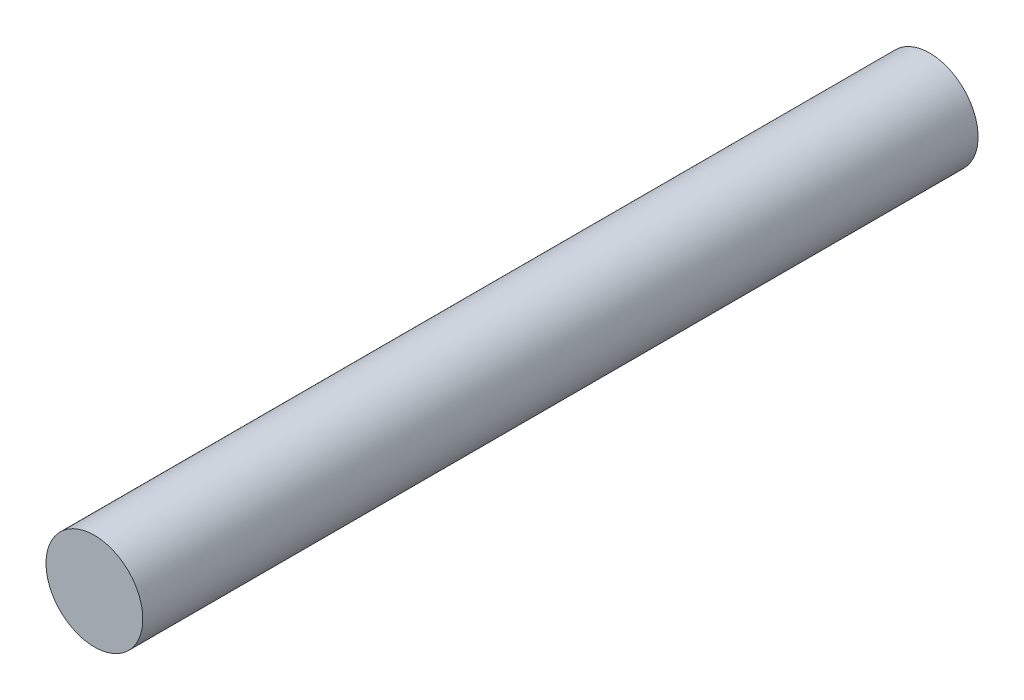
ISO-10303-21;
HEADER;
FILE_DESCRIPTION(('STEP AP214'),'2;1');
FILE_NAME('part.step','',(''),(''),'','','');
FILE_SCHEMA(('AUTOMOTIVE_DESIGN { 1 0 10303 214 1 1 1 1 }'));
ENDSEC;
DATA;
#1=APPLICATION_CONTEXT('core data for automotive mechanical design processes');
#2=APPLICATION_PROTOCOL_DEFINITION('international standard','automotive_design',2000,#1);
#3=PRODUCT_CONTEXT('',#1,'mechanical');
#4=PRODUCT('Part','Part','',(#3));
#5=PRODUCT_RELATED_PRODUCT_CATEGORY('part','',(#4));
#6=PRODUCT_DEFINITION_FORMATION('','',#4);
#7=PRODUCT_DEFINITION_CONTEXT('part definition',#1,'design');
#8=PRODUCT_DEFINITION('design','',#6,#7);
#9=PRODUCT_DEFINITION_SHAPE('','',#8);
#10=(LENGTH_UNIT() NAMED_UNIT(*) SI_UNIT(.MILLI.,.METRE.));
#11=(NAMED_UNIT(*) PLANE_ANGLE_UNIT() SI_UNIT($,.RADIAN.));
#12=(NAMED_UNIT(*) SI_UNIT($,.STERADIAN.) SOLID_ANGLE_UNIT());
#13=UNCERTAINTY_MEASURE_WITH_UNIT(LENGTH_MEASURE(1.E-05),#10,'distance_accuracy_value','');
#14=(GEOMETRIC_REPRESENTATION_CONTEXT(3) GLOBAL_UNCERTAINTY_ASSIGNED_CONTEXT((#13)) GLOBAL_UNIT_ASSIGNED_CONTEXT((#10,
#11,#12)) REPRESENTATION_CONTEXT('',''));
#15=CARTESIAN_POINT('',(0.,0.,0.));
#16=DIRECTION('',(0.,0.,1.));
#17=DIRECTION('',(1.,0.,0.));
#18=AXIS2_PLACEMENT_3D('',#15,#16,#17);
#19=CARTESIAN_POINT('',(0.,-2.49999999999999,96.8137084989847));
#20=DIRECTION('',(0.,0.,-1.));
#21=DIRECTION('',(-1.,0.,0.));
#22=AXIS2_PLACEMENT_3D('',#19,#20,#21);
#23=CYLINDRICAL_SURFACE('',#22,4.);
#24=CARTESIAN_POINT('',(0.,-2.49999999999999,76.5));
#25=DIRECTION('',(0.,0.,-1.));
#26=DIRECTION('',(-1.,0.,0.));
#27=AXIS2_PLACEMENT_3D('',#24,#25,#26);
#28=CIRCLE('',#27,4.);
#29=CARTESIAN_POINT('',(-4.,-2.49999999999999,76.5));
#30=VERTEX_POINT('',#29);
#31=EDGE_CURVE('E10',#30,#30,#28,.F.);
#32=CARTESIAN_POINT('',(0.,-2.49999999999999,7.5));
#33=DIRECTION('',(0.,0.,1.));
#34=DIRECTION('',(0.,-1.,0.));
#35=AXIS2_PLACEMENT_3D('',#32,#33,#34);
#36=CIRCLE('',#35,4.);
#37=CARTESIAN_POINT('',(-4.,-2.49999999999999,7.50000000000001));
#38=VERTEX_POINT('',#37);
#39=EDGE_CURVE('E39',#38,#38,#36,.T.);
#40=CARTESIAN_POINT('',(-4.,-2.49999999999999,76.5));
#41=CARTESIAN_POINT('',(-4.,-2.49999999999999,75.78125));
#42=CARTESIAN_POINT('',(-4.,-2.49999999999999,75.0625));
#43=CARTESIAN_POINT('',(-4.,-2.49999999999999,73.625));
#44=CARTESIAN_POINT('',(-4.,-2.49999999999999,72.90625));
#45=CARTESIAN_POINT('',(-4.,-2.49999999999999,71.46875));
#46=CARTESIAN_POINT('',(-4.,-2.49999999999999,70.75));
#47=CARTESIAN_POINT('',(-4.,-2.49999999999999,69.3125));
#48=CARTESIAN_POINT('',(-4.,-2.49999999999999,68.59375));
#49=CARTESIAN_POINT('',(-4.,-2.49999999999999,67.15625));
#50=CARTESIAN_POINT('',(-4.,-2.49999999999999,66.4375));
#51=CARTESIAN_POINT('',(-4.,-2.49999999999999,65.));
#52=CARTESIAN_POINT('',(-4.,-2.49999999999999,64.28125));
#53=CARTESIAN_POINT('',(-4.,-2.49999999999999,62.84375));
#54=CARTESIAN_POINT('',(-4.,-2.49999999999999,62.125));
#55=CARTESIAN_POINT('',(-4.,-2.49999999999999,60.6875));
#56=CARTESIAN_POINT('',(-4.,-2.49999999999999,59.96875));
#57=CARTESIAN_POINT('',(-4.,-2.49999999999999,58.53125));
#58=CARTESIAN_POINT('',(-4.,-2.49999999999999,57.8125));
#59=CARTESIAN_POINT('',(-4.,-2.49999999999999,56.375));
#60=CARTESIAN_POINT('',(-4.,-2.49999999999999,55.65625));
#61=CARTESIAN_POINT('',(-4.,-2.49999999999999,54.21875));
#62=CARTESIAN_POINT('',(-4.,-2.49999999999999,53.5));
#63=CARTESIAN_POINT('',(-4.,-2.49999999999999,52.0625));
#64=CARTESIAN_POINT('',(-4.,-2.49999999999999,51.34375));
#65=CARTESIAN_POINT('',(-4.,-2.49999999999999,49.90625));
#66=CARTESIAN_POINT('',(-4.,-2.49999999999999,49.1875));
#67=CARTESIAN_POINT('',(-4.,-2.49999999999999,47.75));
#68=CARTESIAN_POINT('',(-4.,-2.49999999999999,47.03125));
#69=CARTESIAN_POINT('',(-4.,-2.49999999999999,45.59375));
#70=CARTESIAN_POINT('',(-4.,-2.49999999999999,44.875));
#71=CARTESIAN_POINT('',(-4.,-2.49999999999999,43.4375));
#72=CARTESIAN_POINT('',(-4.,-2.49999999999999,42.71875));
#73=CARTESIAN_POINT('',(-4.,-2.49999999999999,41.28125));
#74=CARTESIAN_POINT('',(-4.,-2.49999999999999,40.5625));
#75=CARTESIAN_POINT('',(-4.,-2.49999999999999,39.125));
#76=CARTESIAN_POINT('',(-4.,-2.49999999999999,38.40625));
#77=CARTESIAN_POINT('',(-4.,-2.49999999999999,36.96875));
#78=CARTESIAN_POINT('',(-4.,-2.49999999999999,36.25));
#79=CARTESIAN_POINT('',(-4.,-2.49999999999999,34.8125));
#80=CARTESIAN_POINT('',(-4.,-2.49999999999999,34.09375));
#81=CARTESIAN_POINT('',(-4.,-2.49999999999999,32.65625));
#82=CARTESIAN_POINT('',(-4.,-2.49999999999999,31.9375));
#83=CARTESIAN_POINT('',(-4.,-2.49999999999999,30.5));
#84=CARTESIAN_POINT('',(-4.,-2.49999999999999,29.78125));
#85=CARTESIAN_POINT('',(-4.,-2.49999999999999,28.34375));
#86=CARTESIAN_POINT('',(-4.,-2.49999999999999,27.625));
#87=CARTESIAN_POINT('',(-4.,-2.49999999999999,26.1875));
#88=CARTESIAN_POINT('',(-4.,-2.49999999999999,25.46875));
#89=CARTESIAN_POINT('',(-4.,-2.49999999999999,24.03125));
#90=CARTESIAN_POINT('',(-4.,-2.49999999999999,23.3125));
#91=CARTESIAN_POINT('',(-4.,-2.49999999999999,21.875));
#92=CARTESIAN_POINT('',(-4.,-2.49999999999999,21.15625));
#93=CARTESIAN_POINT('',(-4.,-2.49999999999999,19.71875));
#94=CARTESIAN_POINT('',(-4.,-2.49999999999999,19.));
#95=CARTESIAN_POINT('',(-4.,-2.49999999999999,17.5625));
#96=CARTESIAN_POINT('',(-4.,-2.49999999999999,16.84375));
#97=CARTESIAN_POINT('',(-4.,-2.49999999999999,15.40625));
#98=CARTESIAN_POINT('',(-4.,-2.49999999999999,14.6875));
#99=CARTESIAN_POINT('',(-4.,-2.49999999999999,13.25));
#100=CARTESIAN_POINT('',(-4.,-2.49999999999999,12.53125));
#101=CARTESIAN_POINT('',(-4.,-2.49999999999999,11.09375));
#102=CARTESIAN_POINT('',(-4.,-2.49999999999999,10.375));
#103=CARTESIAN_POINT('',(-4.,-2.49999999999999,8.93750000000001));
#104=CARTESIAN_POINT('',(-4.,-2.49999999999999,8.21875000000001));
#105=CARTESIAN_POINT('',(-4.,-2.49999999999999,7.50000000000001));
#106=B_SPLINE_CURVE_WITH_KNOTS('',3,(#40,#41,#42,#43,#44,#45,#46,#47,#48,#49,#50,#51,#52,#53,
#54,#55,#56,#57,#58,#59,#60,#61,#62,#63,#64,#65,#66,#67,#68,#69,#70,#71,#72,#73,#74,#75,#76,#77,
#78,#79,#80,#81,#82,#83,#84,#85,#86,#87,#88,#89,#90,#91,#92,#93,#94,#95,#96,#97,#98,#99,#100,
#101,#102,#103,#104,#105),.UNSPECIFIED.,.F.,.F.,(4,2,2,2,2,2,2,2,2,2,2,2,2,2,2,2,2,2,2,2,2,2,2,
2,2,2,2,2,2,2,2,2,4),(0.,2.15625,4.31250000000001,6.46875000000001,8.62500000000001,10.78125,
12.9375,15.09375,17.25,19.40625,21.5625,23.71875,25.875,28.03125,30.1875,32.34375,34.5,36.65625,
38.8125,40.96875,43.125,45.28125,47.4375,49.59375,51.75,53.90625,56.0625,58.21875,60.375,
62.53125,64.6875,66.84375,69.),.UNSPECIFIED.);
#107=EDGE_CURVE('BSEAM33',#30,#38,#106,.T.);
#108=ORIENTED_EDGE('',*,*,#31,.F.);
#109=ORIENTED_EDGE('',*,*,#39,.T.);
#110=ORIENTED_EDGE('',*,*,#107,.T.);
#111=ORIENTED_EDGE('',*,*,#107,.F.);
#112=EDGE_LOOP('',(#108,#110,#109,#111));
#113=FACE_BOUND('',#112,.T.);
#114=ADVANCED_FACE('F33',(#113),#23,.T.);
#115=CARTESIAN_POINT('',(-35.,12.5,76.5));
#116=DIRECTION('',(0.,0.,-1.));
#117=DIRECTION('',(-1.,0.,0.));
#118=AXIS2_PLACEMENT_3D('',#115,#116,#117);
#119=PLANE('',#118);
#120=ORIENTED_EDGE('',*,*,#31,.T.);
#121=EDGE_LOOP('',(#120));
#122=FACE_BOUND('',#121,.T.);
#123=ADVANCED_FACE('F48',(#122),#119,.F.);
#124=CARTESIAN_POINT('',(-35.,12.5,7.5));
#125=DIRECTION('',(0.,0.,1.));
#126=DIRECTION('',(0.,-1.,0.));
#127=AXIS2_PLACEMENT_3D('',#124,#125,#126);
#128=PLANE('',#127);
#129=ORIENTED_EDGE('',*,*,#39,.F.);
#130=EDGE_LOOP('',(#129));
#131=FACE_BOUND('',#130,.T.);
#132=ADVANCED_FACE('F46',(#131),#128,.F.);
#133=CLOSED_SHELL('',(#114,#123,#132));
#134=MANIFOLD_SOLID_BREP('B2',#133);
#135=ADVANCED_BREP_SHAPE_REPRESENTATION('',(#18,#134),#14);
#136=SHAPE_DEFINITION_REPRESENTATION(#9,#135);
ENDSEC;
END-ISO-10303-21;
